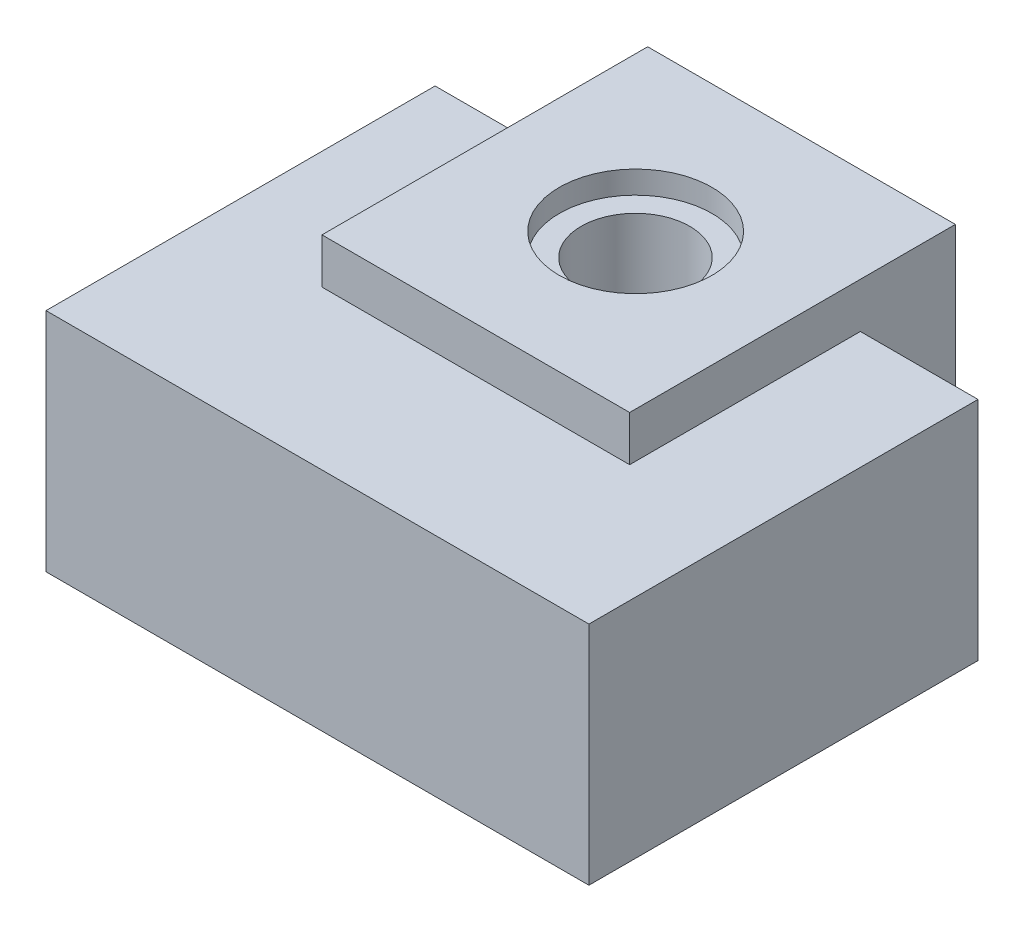
ISO-10303-21;
HEADER;
FILE_DESCRIPTION(('STEP AP214'),'2;1');
FILE_NAME('part.step','',(''),(''),'','','');
FILE_SCHEMA(('AUTOMOTIVE_DESIGN { 1 0 10303 214 1 1 1 1 }'));
ENDSEC;
DATA;
#1=APPLICATION_CONTEXT('core data for automotive mechanical design processes');
#2=APPLICATION_PROTOCOL_DEFINITION('international standard','automotive_design',2000,#1);
#3=PRODUCT_CONTEXT('',#1,'mechanical');
#4=PRODUCT('Part','Part','',(#3));
#5=PRODUCT_RELATED_PRODUCT_CATEGORY('part','',(#4));
#6=PRODUCT_DEFINITION_FORMATION('','',#4);
#7=PRODUCT_DEFINITION_CONTEXT('part definition',#1,'design');
#8=PRODUCT_DEFINITION('design','',#6,#7);
#9=PRODUCT_DEFINITION_SHAPE('','',#8);
#10=(LENGTH_UNIT() NAMED_UNIT(*) SI_UNIT(.MILLI.,.METRE.));
#11=(NAMED_UNIT(*) PLANE_ANGLE_UNIT() SI_UNIT($,.RADIAN.));
#12=(NAMED_UNIT(*) SI_UNIT($,.STERADIAN.) SOLID_ANGLE_UNIT());
#13=UNCERTAINTY_MEASURE_WITH_UNIT(LENGTH_MEASURE(1.E-05),#10,'distance_accuracy_value','');
#14=(GEOMETRIC_REPRESENTATION_CONTEXT(3) GLOBAL_UNCERTAINTY_ASSIGNED_CONTEXT((#13)) GLOBAL_UNIT_ASSIGNED_CONTEXT((#10,
#11,#12)) REPRESENTATION_CONTEXT('',''));
#15=CARTESIAN_POINT('',(0.,0.,0.));
#16=DIRECTION('',(0.,0.,1.));
#17=DIRECTION('',(1.,0.,0.));
#18=AXIS2_PLACEMENT_3D('',#15,#16,#17);
#19=CARTESIAN_POINT('',(29.9982112005698,0.,-35.1447175794565));
#20=DIRECTION('',(0.,1.,0.));
#21=DIRECTION('',(0.,0.,1.));
#22=AXIS2_PLACEMENT_3D('',#19,#20,#21);
#23=CYLINDRICAL_SURFACE('',#22,5.99999999999999);
#24=CARTESIAN_POINT('',(29.9982112005698,0.,-35.1447175794565));
#25=DIRECTION('',(0.,1.,0.));
#26=DIRECTION('',(0.,0.,1.));
#27=AXIS2_PLACEMENT_3D('',#24,#25,#26);
#28=CIRCLE('',#27,5.99999999999999);
#29=CARTESIAN_POINT('',(29.9982112005698,0.,-29.1447175794565));
#30=VERTEX_POINT('',#29);
#31=EDGE_CURVE('E227',#30,#30,#28,.T.);
#32=CARTESIAN_POINT('',(29.9982112005698,27.5,-35.1447175794565));
#33=DIRECTION('',(0.,1.,0.));
#34=DIRECTION('',(0.,0.,1.));
#35=AXIS2_PLACEMENT_3D('',#32,#33,#34);
#36=CIRCLE('',#35,5.99999999999999);
#37=CARTESIAN_POINT('',(29.9982112005698,27.5,-29.1447175794565));
#38=VERTEX_POINT('',#37);
#39=EDGE_CURVE('E221',#38,#38,#36,.F.);
#40=CARTESIAN_POINT('',(29.9982112005698,0.,-29.1447175794565));
#41=CARTESIAN_POINT('',(29.9982112005698,0.286458333333334,-29.1447175794565));
#42=CARTESIAN_POINT('',(29.9982112005698,0.572916666666667,-29.1447175794565));
#43=CARTESIAN_POINT('',(29.9982112005698,1.14583333333333,-29.1447175794565));
#44=CARTESIAN_POINT('',(29.9982112005698,1.43229166666667,-29.1447175794565));
#45=CARTESIAN_POINT('',(29.9982112005698,2.00520833333333,-29.1447175794565));
#46=CARTESIAN_POINT('',(29.9982112005698,2.29166666666667,-29.1447175794565));
#47=CARTESIAN_POINT('',(29.9982112005698,2.86458333333333,-29.1447175794565));
#48=CARTESIAN_POINT('',(29.9982112005698,3.15104166666667,-29.1447175794565));
#49=CARTESIAN_POINT('',(29.9982112005698,3.72395833333333,-29.1447175794565));
#50=CARTESIAN_POINT('',(29.9982112005698,4.01041666666667,-29.1447175794565));
#51=CARTESIAN_POINT('',(29.9982112005698,4.58333333333333,-29.1447175794565));
#52=CARTESIAN_POINT('',(29.9982112005698,4.86979166666667,-29.1447175794565));
#53=CARTESIAN_POINT('',(29.9982112005698,5.44270833333333,-29.1447175794565));
#54=CARTESIAN_POINT('',(29.9982112005698,5.72916666666667,-29.1447175794565));
#55=CARTESIAN_POINT('',(29.9982112005698,6.30208333333333,-29.1447175794565));
#56=CARTESIAN_POINT('',(29.9982112005698,6.58854166666667,-29.1447175794565));
#57=CARTESIAN_POINT('',(29.9982112005698,7.16145833333333,-29.1447175794565));
#58=CARTESIAN_POINT('',(29.9982112005698,7.44791666666667,-29.1447175794565));
#59=CARTESIAN_POINT('',(29.9982112005698,8.02083333333333,-29.1447175794565));
#60=CARTESIAN_POINT('',(29.9982112005698,8.30729166666667,-29.1447175794565));
#61=CARTESIAN_POINT('',(29.9982112005698,8.88020833333333,-29.1447175794565));
#62=CARTESIAN_POINT('',(29.9982112005698,9.16666666666667,-29.1447175794565));
#63=CARTESIAN_POINT('',(29.9982112005698,9.73958333333333,-29.1447175794565));
#64=CARTESIAN_POINT('',(29.9982112005698,10.0260416666667,-29.1447175794565));
#65=CARTESIAN_POINT('',(29.9982112005698,10.5989583333333,-29.1447175794565));
#66=CARTESIAN_POINT('',(29.9982112005698,10.8854166666667,-29.1447175794565));
#67=CARTESIAN_POINT('',(29.9982112005698,11.4583333333333,-29.1447175794565));
#68=CARTESIAN_POINT('',(29.9982112005698,11.7447916666667,-29.1447175794565));
#69=CARTESIAN_POINT('',(29.9982112005698,12.3177083333333,-29.1447175794565));
#70=CARTESIAN_POINT('',(29.9982112005698,12.6041666666667,-29.1447175794565));
#71=CARTESIAN_POINT('',(29.9982112005698,13.1770833333333,-29.1447175794565));
#72=CARTESIAN_POINT('',(29.9982112005698,13.4635416666667,-29.1447175794565));
#73=CARTESIAN_POINT('',(29.9982112005698,14.0364583333333,-29.1447175794565));
#74=CARTESIAN_POINT('',(29.9982112005698,14.3229166666667,-29.1447175794565));
#75=CARTESIAN_POINT('',(29.9982112005698,14.8958333333333,-29.1447175794565));
#76=CARTESIAN_POINT('',(29.9982112005698,15.1822916666667,-29.1447175794565));
#77=CARTESIAN_POINT('',(29.9982112005698,15.7552083333333,-29.1447175794565));
#78=CARTESIAN_POINT('',(29.9982112005698,16.0416666666667,-29.1447175794565));
#79=CARTESIAN_POINT('',(29.9982112005698,16.6145833333333,-29.1447175794565));
#80=CARTESIAN_POINT('',(29.9982112005698,16.9010416666667,-29.1447175794565));
#81=CARTESIAN_POINT('',(29.9982112005698,17.4739583333333,-29.1447175794565));
#82=CARTESIAN_POINT('',(29.9982112005698,17.7604166666667,-29.1447175794565));
#83=CARTESIAN_POINT('',(29.9982112005698,18.3333333333333,-29.1447175794565));
#84=CARTESIAN_POINT('',(29.9982112005698,18.6197916666667,-29.1447175794565));
#85=CARTESIAN_POINT('',(29.9982112005698,19.1927083333333,-29.1447175794565));
#86=CARTESIAN_POINT('',(29.9982112005698,19.4791666666667,-29.1447175794565));
#87=CARTESIAN_POINT('',(29.9982112005698,20.0520833333333,-29.1447175794565));
#88=CARTESIAN_POINT('',(29.9982112005698,20.3385416666667,-29.1447175794565));
#89=CARTESIAN_POINT('',(29.9982112005698,20.9114583333333,-29.1447175794565));
#90=CARTESIAN_POINT('',(29.9982112005698,21.1979166666667,-29.1447175794565));
#91=CARTESIAN_POINT('',(29.9982112005698,21.7708333333333,-29.1447175794565));
#92=CARTESIAN_POINT('',(29.9982112005698,22.0572916666667,-29.1447175794565));
#93=CARTESIAN_POINT('',(29.9982112005698,22.6302083333333,-29.1447175794565));
#94=CARTESIAN_POINT('',(29.9982112005698,22.9166666666667,-29.1447175794565));
#95=CARTESIAN_POINT('',(29.9982112005698,23.4895833333333,-29.1447175794565));
#96=CARTESIAN_POINT('',(29.9982112005698,23.7760416666667,-29.1447175794565));
#97=CARTESIAN_POINT('',(29.9982112005698,24.3489583333333,-29.1447175794565));
#98=CARTESIAN_POINT('',(29.9982112005698,24.6354166666667,-29.1447175794565));
#99=CARTESIAN_POINT('',(29.9982112005698,25.2083333333333,-29.1447175794565));
#100=CARTESIAN_POINT('',(29.9982112005698,25.4947916666667,-29.1447175794565));
#101=CARTESIAN_POINT('',(29.9982112005698,26.0677083333333,-29.1447175794565));
#102=CARTESIAN_POINT('',(29.9982112005698,26.3541666666667,-29.1447175794565));
#103=CARTESIAN_POINT('',(29.9982112005698,26.9270833333333,-29.1447175794565));
#104=CARTESIAN_POINT('',(29.9982112005698,27.2135416666667,-29.1447175794565));
#105=CARTESIAN_POINT('',(29.9982112005698,27.5,-29.1447175794565));
#106=B_SPLINE_CURVE_WITH_KNOTS('',3,(#40,#41,#42,#43,#44,#45,#46,#47,#48,#49,#50,#51,#52,#53,
#54,#55,#56,#57,#58,#59,#60,#61,#62,#63,#64,#65,#66,#67,#68,#69,#70,#71,#72,#73,#74,#75,#76,#77,
#78,#79,#80,#81,#82,#83,#84,#85,#86,#87,#88,#89,#90,#91,#92,#93,#94,#95,#96,#97,#98,#99,#100,
#101,#102,#103,#104,#105),.UNSPECIFIED.,.F.,.F.,(4,2,2,2,2,2,2,2,2,2,2,2,2,2,2,2,2,2,2,2,2,2,2,
2,2,2,2,2,2,2,2,2,4),(0.,0.859375,1.71875,2.578125,3.4375,4.296875,5.15625,6.015625,6.875,
7.734375,8.59375,9.453125,10.3125,11.171875,12.03125,12.890625,13.75,14.609375,15.46875,
16.328125,17.1875,18.046875,18.90625,19.765625,20.625,21.484375,22.34375,23.203125,24.0625,
24.921875,25.78125,26.640625,27.5),.UNSPECIFIED.);
#107=EDGE_CURVE('BSEAM49',#30,#38,#106,.T.);
#108=ORIENTED_EDGE('',*,*,#31,.F.);
#109=ORIENTED_EDGE('',*,*,#39,.F.);
#110=ORIENTED_EDGE('',*,*,#107,.T.);
#111=ORIENTED_EDGE('',*,*,#107,.F.);
#112=EDGE_LOOP('',(#108,#110,#109,#111));
#113=FACE_BOUND('',#112,.T.);
#114=ADVANCED_FACE('F49',(#113),#23,.F.);
#115=CARTESIAN_POINT('',(0.,25.,-43.));
#116=DIRECTION('',(0.,0.,1.));
#117=DIRECTION('',(1.,0.,0.));
#118=AXIS2_PLACEMENT_3D('',#115,#116,#117);
#119=PLANE('',#118);
#120=DIRECTION('',(0.,-1.,0.));
#121=VECTOR('',#120,1.);
#122=CARTESIAN_POINT('',(47.,30.,-43.));
#123=LINE('',#122,#121);
#124=CARTESIAN_POINT('',(47.,25.,-43.));
#125=VERTEX_POINT('',#124);
#126=CARTESIAN_POINT('',(47.,0.,-43.));
#127=VERTEX_POINT('',#126);
#128=EDGE_CURVE('E12',#125,#127,#123,.T.);
#129=ORIENTED_EDGE('',*,*,#128,.F.);
#130=DIRECTION('',(-1.,0.,0.));
#131=VECTOR('',#130,1.);
#132=CARTESIAN_POINT('',(0.,25.,-43.));
#133=LINE('',#132,#131);
#134=CARTESIAN_POINT('',(60.,25.,-43.));
#135=VERTEX_POINT('',#134);
#136=EDGE_CURVE('E200',#135,#125,#133,.T.);
#137=ORIENTED_EDGE('',*,*,#136,.F.);
#138=DIRECTION('',(0.,-1.,0.));
#139=VECTOR('',#138,1.);
#140=CARTESIAN_POINT('',(60.,25.,-43.));
#141=LINE('',#140,#139);
#142=CARTESIAN_POINT('',(60.,0.,-43.));
#143=VERTEX_POINT('',#142);
#144=EDGE_CURVE('E215',#135,#143,#141,.T.);
#145=ORIENTED_EDGE('',*,*,#144,.T.);
#146=DIRECTION('',(-1.,0.,0.));
#147=VECTOR('',#146,1.);
#148=CARTESIAN_POINT('',(0.,0.,-43.));
#149=LINE('',#148,#147);
#150=EDGE_CURVE('E74',#143,#127,#149,.T.);
#151=ORIENTED_EDGE('',*,*,#150,.T.);
#152=EDGE_LOOP('',(#129,#137,#145,#151));
#153=FACE_BOUND('',#152,.T.);
#154=ADVANCED_FACE('F262',(#153),#119,.F.);
#155=DIRECTION('',(0.,1.,0.));
#156=VECTOR('',#155,1.);
#157=CARTESIAN_POINT('',(12.992700729927,30.,-43.));
#158=LINE('',#157,#156);
#159=CARTESIAN_POINT('',(12.992700729927,0.,-43.));
#160=VERTEX_POINT('',#159);
#161=CARTESIAN_POINT('',(12.992700729927,25.,-43.));
#162=VERTEX_POINT('',#161);
#163=EDGE_CURVE('E66',#160,#162,#158,.T.);
#164=ORIENTED_EDGE('',*,*,#163,.F.);
#165=CARTESIAN_POINT('',(0.,0.,-43.));
#166=VERTEX_POINT('',#165);
#167=EDGE_CURVE('E211',#160,#166,#149,.T.);
#168=ORIENTED_EDGE('',*,*,#167,.T.);
#169=DIRECTION('',(0.,-1.,0.));
#170=VECTOR('',#169,1.);
#171=CARTESIAN_POINT('',(0.,25.,-43.));
#172=LINE('',#171,#170);
#173=CARTESIAN_POINT('',(0.,25.,-43.));
#174=VERTEX_POINT('',#173);
#175=EDGE_CURVE('E203',#174,#166,#172,.T.);
#176=ORIENTED_EDGE('',*,*,#175,.F.);
#177=EDGE_CURVE('E199',#162,#174,#133,.T.);
#178=ORIENTED_EDGE('',*,*,#177,.F.);
#179=EDGE_LOOP('',(#164,#168,#176,#178));
#180=FACE_BOUND('',#179,.T.);
#181=ADVANCED_FACE('F292',(#180),#119,.F.);
#182=CARTESIAN_POINT('',(0.,25.,0.));
#183=DIRECTION('',(0.,-1.,0.));
#184=DIRECTION('',(0.,0.,-1.));
#185=AXIS2_PLACEMENT_3D('',#182,#183,#184);
#186=PLANE('',#185);
#187=DIRECTION('',(0.,0.,1.));
#188=VECTOR('',#187,1.);
#189=CARTESIAN_POINT('',(13.,25.,-43.));
#190=LINE('',#189,#188);
#191=CARTESIAN_POINT('',(13.,25.,-43.));
#192=VERTEX_POINT('',#191);
#193=CARTESIAN_POINT('',(13.,25.,-17.5));
#194=VERTEX_POINT('',#193);
#195=EDGE_CURVE('E162',#192,#194,#190,.T.);
#196=ORIENTED_EDGE('',*,*,#195,.F.);
#197=EDGE_CURVE('E204',#192,#162,#133,.T.);
#198=ORIENTED_EDGE('',*,*,#197,.T.);
#199=ORIENTED_EDGE('',*,*,#177,.T.);
#200=DIRECTION('',(0.,0.,1.));
#201=VECTOR('',#200,1.);
#202=CARTESIAN_POINT('',(0.,25.,0.));
#203=LINE('',#202,#201);
#204=CARTESIAN_POINT('',(0.,25.,0.));
#205=VERTEX_POINT('',#204);
#206=EDGE_CURVE('E192',#174,#205,#203,.T.);
#207=ORIENTED_EDGE('',*,*,#206,.T.);
#208=DIRECTION('',(1.,0.,0.));
#209=VECTOR('',#208,1.);
#210=CARTESIAN_POINT('',(0.,25.,0.));
#211=LINE('',#210,#209);
#212=CARTESIAN_POINT('',(60.,25.,0.));
#213=VERTEX_POINT('',#212);
#214=EDGE_CURVE('E195',#205,#213,#211,.T.);
#215=ORIENTED_EDGE('',*,*,#214,.T.);
#216=DIRECTION('',(0.,0.,-1.));
#217=VECTOR('',#216,1.);
#218=CARTESIAN_POINT('',(60.,25.,0.));
#219=LINE('',#218,#217);
#220=EDGE_CURVE('E197',#213,#135,#219,.T.);
#221=ORIENTED_EDGE('',*,*,#220,.T.);
#222=ORIENTED_EDGE('',*,*,#136,.T.);
#223=DIRECTION('',(0.,0.,-1.));
#224=VECTOR('',#223,1.);
#225=CARTESIAN_POINT('',(47.,25.,-43.));
#226=LINE('',#225,#224);
#227=CARTESIAN_POINT('',(47.,25.,-17.5));
#228=VERTEX_POINT('',#227);
#229=EDGE_CURVE('E175',#228,#125,#226,.T.);
#230=ORIENTED_EDGE('',*,*,#229,.F.);
#231=DIRECTION('',(1.,0.,0.));
#232=VECTOR('',#231,1.);
#233=CARTESIAN_POINT('',(13.,25.,-17.5));
#234=LINE('',#233,#232);
#235=EDGE_CURVE('E165',#194,#228,#234,.T.);
#236=ORIENTED_EDGE('',*,*,#235,.F.);
#237=EDGE_LOOP('',(#196,#198,#199,#207,#215,#221,#222,#230,#236));
#238=FACE_BOUND('',#237,.T.);
#239=ADVANCED_FACE('F258',(#238),#186,.F.);
#240=CARTESIAN_POINT('',(0.,25.,0.));
#241=DIRECTION('',(1.,0.,0.));
#242=DIRECTION('',(0.,0.,-1.));
#243=AXIS2_PLACEMENT_3D('',#240,#241,#242);
#244=PLANE('',#243);
#245=DIRECTION('',(0.,0.,1.));
#246=VECTOR('',#245,1.);
#247=CARTESIAN_POINT('',(0.,0.,0.));
#248=LINE('',#247,#246);
#249=CARTESIAN_POINT('',(0.,0.,0.));
#250=VERTEX_POINT('',#249);
#251=EDGE_CURVE('E191',#166,#250,#248,.T.);
#252=ORIENTED_EDGE('',*,*,#251,.T.);
#253=DIRECTION('',(0.,-1.,0.));
#254=VECTOR('',#253,1.);
#255=CARTESIAN_POINT('',(0.,25.,0.));
#256=LINE('',#255,#254);
#257=EDGE_CURVE('E58',#205,#250,#256,.T.);
#258=ORIENTED_EDGE('',*,*,#257,.F.);
#259=ORIENTED_EDGE('',*,*,#206,.F.);
#260=ORIENTED_EDGE('',*,*,#175,.T.);
#261=EDGE_LOOP('',(#252,#258,#259,#260));
#262=FACE_BOUND('',#261,.T.);
#263=ADVANCED_FACE('F51',(#262),#244,.F.);
#264=CARTESIAN_POINT('',(0.,25.,0.));
#265=DIRECTION('',(0.,0.,-1.));
#266=DIRECTION('',(-1.,0.,0.));
#267=AXIS2_PLACEMENT_3D('',#264,#265,#266);
#268=PLANE('',#267);
#269=DIRECTION('',(1.,0.,0.));
#270=VECTOR('',#269,1.);
#271=CARTESIAN_POINT('',(0.,0.,0.));
#272=LINE('',#271,#270);
#273=CARTESIAN_POINT('',(60.,0.,0.));
#274=VERTEX_POINT('',#273);
#275=EDGE_CURVE('E207',#250,#274,#272,.T.);
#276=ORIENTED_EDGE('',*,*,#275,.T.);
#277=DIRECTION('',(0.,-1.,0.));
#278=VECTOR('',#277,1.);
#279=CARTESIAN_POINT('',(60.,25.,0.));
#280=LINE('',#279,#278);
#281=EDGE_CURVE('E217',#213,#274,#280,.T.);
#282=ORIENTED_EDGE('',*,*,#281,.F.);
#283=ORIENTED_EDGE('',*,*,#214,.F.);
#284=ORIENTED_EDGE('',*,*,#257,.T.);
#285=EDGE_LOOP('',(#276,#282,#283,#284));
#286=FACE_BOUND('',#285,.T.);
#287=ADVANCED_FACE('F268',(#286),#268,.F.);
#288=CARTESIAN_POINT('',(60.,25.,0.));
#289=DIRECTION('',(-1.,0.,0.));
#290=DIRECTION('',(0.,0.,1.));
#291=AXIS2_PLACEMENT_3D('',#288,#289,#290);
#292=PLANE('',#291);
#293=DIRECTION('',(0.,0.,-1.));
#294=VECTOR('',#293,1.);
#295=CARTESIAN_POINT('',(60.,0.,0.));
#296=LINE('',#295,#294);
#297=EDGE_CURVE('E209',#274,#143,#296,.T.);
#298=ORIENTED_EDGE('',*,*,#297,.T.);
#299=ORIENTED_EDGE('',*,*,#144,.F.);
#300=ORIENTED_EDGE('',*,*,#220,.F.);
#301=ORIENTED_EDGE('',*,*,#281,.T.);
#302=EDGE_LOOP('',(#298,#299,#300,#301));
#303=FACE_BOUND('',#302,.T.);
#304=ADVANCED_FACE('F265',(#303),#292,.F.);
#305=CARTESIAN_POINT('',(0.,0.,0.));
#306=DIRECTION('',(0.,-1.,0.));
#307=DIRECTION('',(0.,0.,-1.));
#308=AXIS2_PLACEMENT_3D('',#305,#306,#307);
#309=PLANE('',#308);
#310=ORIENTED_EDGE('',*,*,#31,.T.);
#311=EDGE_LOOP('',(#310));
#312=FACE_BOUND('',#311,.T.);
#313=ORIENTED_EDGE('',*,*,#251,.F.);
#314=ORIENTED_EDGE('',*,*,#167,.F.);
#315=DIRECTION('',(0.,0.,1.));
#316=VECTOR('',#315,1.);
#317=CARTESIAN_POINT('',(12.992700729927,0.,-53.5));
#318=LINE('',#317,#316);
#319=CARTESIAN_POINT('',(12.992700729927,0.,-53.5));
#320=VERTEX_POINT('',#319);
#321=EDGE_CURVE('E145',#320,#160,#318,.T.);
#322=ORIENTED_EDGE('',*,*,#321,.F.);
#323=DIRECTION('',(-1.,0.,0.));
#324=VECTOR('',#323,1.);
#325=CARTESIAN_POINT('',(47.,0.,-53.5));
#326=LINE('',#325,#324);
#327=CARTESIAN_POINT('',(47.,0.,-53.5));
#328=VERTEX_POINT('',#327);
#329=EDGE_CURVE('E138',#328,#320,#326,.T.);
#330=ORIENTED_EDGE('',*,*,#329,.F.);
#331=DIRECTION('',(0.,0.,1.));
#332=VECTOR('',#331,1.);
#333=CARTESIAN_POINT('',(47.,0.,-53.5));
#334=LINE('',#333,#332);
#335=EDGE_CURVE('E143',#328,#127,#334,.T.);
#336=ORIENTED_EDGE('',*,*,#335,.T.);
#337=ORIENTED_EDGE('',*,*,#150,.F.);
#338=ORIENTED_EDGE('',*,*,#297,.F.);
#339=ORIENTED_EDGE('',*,*,#275,.F.);
#340=EDGE_LOOP('',(#313,#314,#322,#330,#336,#337,#338,#339));
#341=FACE_BOUND('',#340,.T.);
#342=ADVANCED_FACE('F141',(#312,#341),#309,.T.);
#343=CARTESIAN_POINT('',(13.,30.,-43.));
#344=DIRECTION('',(1.,0.,0.));
#345=DIRECTION('',(0.,0.,-1.));
#346=AXIS2_PLACEMENT_3D('',#343,#344,#345);
#347=PLANE('',#346);
#348=ORIENTED_EDGE('',*,*,#195,.T.);
#349=DIRECTION('',(0.,-1.,0.));
#350=VECTOR('',#349,1.);
#351=CARTESIAN_POINT('',(13.,30.,-17.5));
#352=LINE('',#351,#350);
#353=CARTESIAN_POINT('',(13.,30.,-17.5));
#354=VERTEX_POINT('',#353);
#355=EDGE_CURVE('E188',#354,#194,#352,.T.);
#356=ORIENTED_EDGE('',*,*,#355,.F.);
#357=DIRECTION('',(0.,0.,1.));
#358=VECTOR('',#357,1.);
#359=CARTESIAN_POINT('',(13.,30.,-43.));
#360=LINE('',#359,#358);
#361=CARTESIAN_POINT('',(13.,30.,-43.));
#362=VERTEX_POINT('',#361);
#363=EDGE_CURVE('E171',#362,#354,#360,.T.);
#364=ORIENTED_EDGE('',*,*,#363,.F.);
#365=DIRECTION('',(0.,-1.,0.));
#366=VECTOR('',#365,1.);
#367=CARTESIAN_POINT('',(13.,30.,-43.));
#368=LINE('',#367,#366);
#369=EDGE_CURVE('E178',#362,#192,#368,.T.);
#370=ORIENTED_EDGE('',*,*,#369,.T.);
#371=EDGE_LOOP('',(#348,#356,#364,#370));
#372=FACE_BOUND('',#371,.T.);
#373=ADVANCED_FACE('F252',(#372),#347,.F.);
#374=CARTESIAN_POINT('',(13.,30.,-17.5));
#375=DIRECTION('',(0.,0.,-1.));
#376=DIRECTION('',(-1.,0.,0.));
#377=AXIS2_PLACEMENT_3D('',#374,#375,#376);
#378=PLANE('',#377);
#379=ORIENTED_EDGE('',*,*,#235,.T.);
#380=DIRECTION('',(0.,-1.,0.));
#381=VECTOR('',#380,1.);
#382=CARTESIAN_POINT('',(47.,30.,-17.5));
#383=LINE('',#382,#381);
#384=CARTESIAN_POINT('',(47.,30.,-17.5));
#385=VERTEX_POINT('',#384);
#386=EDGE_CURVE('E185',#385,#228,#383,.T.);
#387=ORIENTED_EDGE('',*,*,#386,.F.);
#388=DIRECTION('',(1.,0.,0.));
#389=VECTOR('',#388,1.);
#390=CARTESIAN_POINT('',(13.,30.,-17.5));
#391=LINE('',#390,#389);
#392=EDGE_CURVE('E174',#354,#385,#391,.T.);
#393=ORIENTED_EDGE('',*,*,#392,.F.);
#394=ORIENTED_EDGE('',*,*,#355,.T.);
#395=EDGE_LOOP('',(#379,#387,#393,#394));
#396=FACE_BOUND('',#395,.T.);
#397=ADVANCED_FACE('F256',(#396),#378,.F.);
#398=CARTESIAN_POINT('',(47.,30.,-43.));
#399=DIRECTION('',(-1.,0.,0.));
#400=DIRECTION('',(0.,0.,1.));
#401=AXIS2_PLACEMENT_3D('',#398,#399,#400);
#402=PLANE('',#401);
#403=ORIENTED_EDGE('',*,*,#229,.T.);
#404=ORIENTED_EDGE('',*,*,#128,.T.);
#405=ORIENTED_EDGE('',*,*,#335,.F.);
#406=DIRECTION('',(0.,-1.,0.));
#407=VECTOR('',#406,1.);
#408=CARTESIAN_POINT('',(47.,30.,-53.5));
#409=LINE('',#408,#407);
#410=CARTESIAN_POINT('',(47.,30.,-53.5));
#411=VERTEX_POINT('',#410);
#412=EDGE_CURVE('E149',#411,#328,#409,.T.);
#413=ORIENTED_EDGE('',*,*,#412,.F.);
#414=DIRECTION('',(0.,0.,-1.));
#415=VECTOR('',#414,1.);
#416=CARTESIAN_POINT('',(47.,30.,-43.));
#417=LINE('',#416,#415);
#418=EDGE_CURVE('E177',#385,#411,#417,.T.);
#419=ORIENTED_EDGE('',*,*,#418,.F.);
#420=ORIENTED_EDGE('',*,*,#386,.T.);
#421=EDGE_LOOP('',(#403,#404,#405,#413,#419,#420));
#422=FACE_BOUND('',#421,.T.);
#423=ADVANCED_FACE('F161',(#422),#402,.F.);
#424=CARTESIAN_POINT('',(0.,30.,0.));
#425=DIRECTION('',(0.,1.,0.));
#426=DIRECTION('',(0.,0.,1.));
#427=AXIS2_PLACEMENT_3D('',#424,#425,#426);
#428=PLANE('',#427);
#429=CARTESIAN_POINT('',(29.9982090549014,30.,-35.1658824525361));
#430=DIRECTION('',(0.,1.,0.));
#431=DIRECTION('',(0.,0.,1.));
#432=AXIS2_PLACEMENT_3D('',#429,#430,#431);
#433=CIRCLE('',#432,8.43755261716648);
#434=CARTESIAN_POINT('',(29.9982090549014,30.,-26.7283298353696));
#435=VERTEX_POINT('',#434);
#436=EDGE_CURVE('E53',#435,#435,#433,.T.);
#437=ORIENTED_EDGE('',*,*,#436,.F.);
#438=EDGE_LOOP('',(#437));
#439=FACE_BOUND('',#438,.T.);
#440=ORIENTED_EDGE('',*,*,#363,.T.);
#441=ORIENTED_EDGE('',*,*,#392,.T.);
#442=ORIENTED_EDGE('',*,*,#418,.T.);
#443=DIRECTION('',(1.,0.,0.));
#444=VECTOR('',#443,1.);
#445=CARTESIAN_POINT('',(47.,30.,-53.5));
#446=LINE('',#445,#444);
#447=CARTESIAN_POINT('',(12.992700729927,30.,-53.5));
#448=VERTEX_POINT('',#447);
#449=EDGE_CURVE('E155',#448,#411,#446,.T.);
#450=ORIENTED_EDGE('',*,*,#449,.F.);
#451=DIRECTION('',(0.,0.,1.));
#452=VECTOR('',#451,1.);
#453=CARTESIAN_POINT('',(12.992700729927,30.,-53.5));
#454=LINE('',#453,#452);
#455=CARTESIAN_POINT('',(12.992700729927,30.,-43.));
#456=VERTEX_POINT('',#455);
#457=EDGE_CURVE('E167',#448,#456,#454,.T.);
#458=ORIENTED_EDGE('',*,*,#457,.T.);
#459=DIRECTION('',(1.,0.,0.));
#460=VECTOR('',#459,1.);
#461=CARTESIAN_POINT('',(47.,30.,-43.));
#462=LINE('',#461,#460);
#463=EDGE_CURVE('E158',#456,#362,#462,.T.);
#464=ORIENTED_EDGE('',*,*,#463,.T.);
#465=EDGE_LOOP('',(#440,#441,#442,#450,#458,#464));
#466=FACE_BOUND('',#465,.T.);
#467=ADVANCED_FACE('F244',(#439,#466),#428,.T.);
#468=CARTESIAN_POINT('',(12.992700729927,30.,-53.5));
#469=DIRECTION('',(1.,0.,0.));
#470=DIRECTION('',(0.,1.,0.));
#471=AXIS2_PLACEMENT_3D('',#468,#469,#470);
#472=PLANE('',#471);
#473=ORIENTED_EDGE('',*,*,#163,.T.);
#474=EDGE_CURVE('E234',#162,#456,#158,.T.);
#475=ORIENTED_EDGE('',*,*,#474,.T.);
#476=ORIENTED_EDGE('',*,*,#457,.F.);
#477=DIRECTION('',(0.,1.,0.));
#478=VECTOR('',#477,1.);
#479=CARTESIAN_POINT('',(12.992700729927,30.,-53.5));
#480=LINE('',#479,#478);
#481=EDGE_CURVE('E148',#320,#448,#480,.T.);
#482=ORIENTED_EDGE('',*,*,#481,.F.);
#483=ORIENTED_EDGE('',*,*,#321,.T.);
#484=EDGE_LOOP('',(#473,#475,#476,#482,#483));
#485=FACE_BOUND('',#484,.T.);
#486=ADVANCED_FACE('F273',(#485),#472,.F.);
#487=CARTESIAN_POINT('',(0.,0.,-53.5));
#488=DIRECTION('',(0.,0.,-1.));
#489=DIRECTION('',(-1.,0.,0.));
#490=AXIS2_PLACEMENT_3D('',#487,#488,#489);
#491=PLANE('',#490);
#492=ORIENTED_EDGE('',*,*,#412,.T.);
#493=ORIENTED_EDGE('',*,*,#329,.T.);
#494=ORIENTED_EDGE('',*,*,#481,.T.);
#495=ORIENTED_EDGE('',*,*,#449,.T.);
#496=EDGE_LOOP('',(#492,#493,#494,#495));
#497=FACE_BOUND('',#496,.T.);
#498=ADVANCED_FACE('F153',(#497),#491,.T.);
#499=CARTESIAN_POINT('',(0.,0.,-43.));
#500=DIRECTION('',(0.,0.,-1.));
#501=DIRECTION('',(-1.,0.,0.));
#502=AXIS2_PLACEMENT_3D('',#499,#500,#501);
#503=PLANE('',#502);
#504=ORIENTED_EDGE('',*,*,#197,.F.);
#505=ORIENTED_EDGE('',*,*,#369,.F.);
#506=ORIENTED_EDGE('',*,*,#463,.F.);
#507=ORIENTED_EDGE('',*,*,#474,.F.);
#508=EDGE_LOOP('',(#504,#505,#506,#507));
#509=FACE_BOUND('',#508,.T.);
#510=ADVANCED_FACE('F250',(#509),#503,.F.);
#511=CARTESIAN_POINT('',(29.9982090549014,27.5,-35.1658824525361));
#512=DIRECTION('',(0.,1.,0.));
#513=DIRECTION('',(0.,0.,1.));
#514=AXIS2_PLACEMENT_3D('',#511,#512,#513);
#515=PLANE('',#514);
#516=CARTESIAN_POINT('',(29.9982090549014,27.5,-35.1658824525361));
#517=DIRECTION('',(0.,1.,0.));
#518=DIRECTION('',(0.,0.,1.));
#519=AXIS2_PLACEMENT_3D('',#516,#517,#518);
#520=CIRCLE('',#519,8.43755261716648);
#521=CARTESIAN_POINT('',(29.9982090549014,27.5,-26.7283298353696));
#522=VERTEX_POINT('',#521);
#523=EDGE_CURVE('E223',#522,#522,#520,.T.);
#524=ORIENTED_EDGE('',*,*,#523,.T.);
#525=EDGE_LOOP('',(#524));
#526=FACE_BOUND('',#525,.T.);
#527=ORIENTED_EDGE('',*,*,#39,.T.);
#528=EDGE_LOOP('',(#527));
#529=FACE_BOUND('',#528,.T.);
#530=ADVANCED_FACE('F300',(#526,#529),#515,.T.);
#531=CARTESIAN_POINT('',(29.9982090549014,27.5,-35.1658824525361));
#532=DIRECTION('',(0.,1.,0.));
#533=DIRECTION('',(0.,0.,1.));
#534=AXIS2_PLACEMENT_3D('',#531,#532,#533);
#535=CYLINDRICAL_SURFACE('',#534,8.43755261716648);
#536=ORIENTED_EDGE('',*,*,#436,.T.);
#537=EDGE_LOOP('',(#536));
#538=FACE_BOUND('',#537,.T.);
#539=ORIENTED_EDGE('',*,*,#523,.F.);
#540=EDGE_LOOP('',(#539));
#541=FACE_BOUND('',#540,.T.);
#542=ADVANCED_FACE('F297',(#538,#541),#535,.F.);
#543=CLOSED_SHELL('',(#114,#154,#181,#239,#263,#287,#304,#342,#373,#397,#423,#467,#486,#498,
#510,#530,#542));
#544=MANIFOLD_SOLID_BREP('B2',#543);
#545=ADVANCED_BREP_SHAPE_REPRESENTATION('',(#18,#544),#14);
#546=SHAPE_DEFINITION_REPRESENTATION(#9,#545);
ENDSEC;
END-ISO-10303-21;
